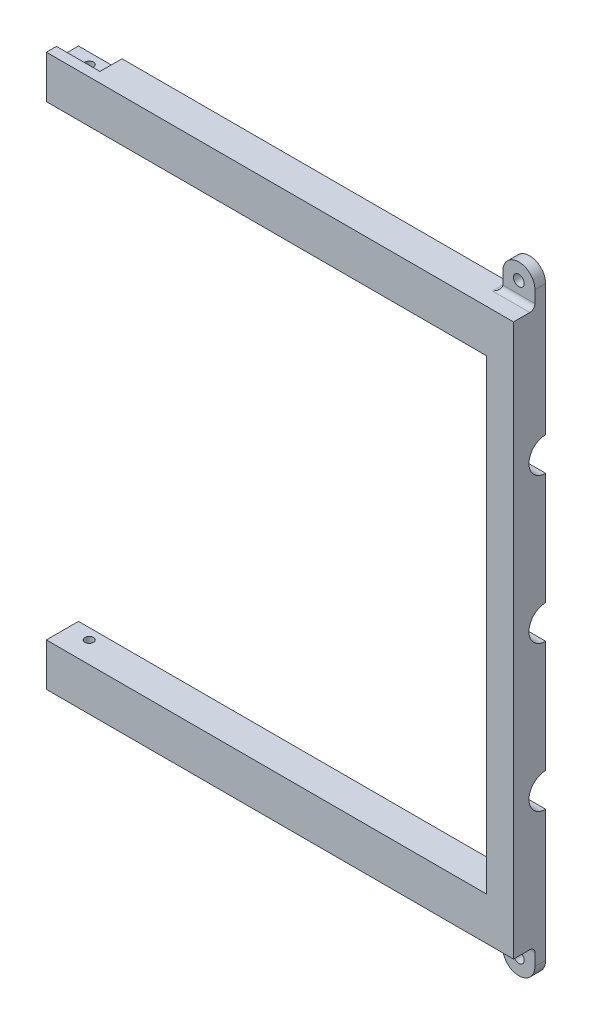
ISO-10303-21;
HEADER;
FILE_DESCRIPTION(('STEP AP214'),'2;1');
FILE_NAME('part.step','',(''),(''),'','','');
FILE_SCHEMA(('AUTOMOTIVE_DESIGN { 1 0 10303 214 1 1 1 1 }'));
ENDSEC;
DATA;
#1=APPLICATION_CONTEXT('core data for automotive mechanical design processes');
#2=APPLICATION_PROTOCOL_DEFINITION('international standard','automotive_design',2000,#1);
#3=PRODUCT_CONTEXT('',#1,'mechanical');
#4=PRODUCT('Part','Part','',(#3));
#5=PRODUCT_RELATED_PRODUCT_CATEGORY('part','',(#4));
#6=PRODUCT_DEFINITION_FORMATION('','',#4);
#7=PRODUCT_DEFINITION_CONTEXT('part definition',#1,'design');
#8=PRODUCT_DEFINITION('design','',#6,#7);
#9=PRODUCT_DEFINITION_SHAPE('','',#8);
#10=(LENGTH_UNIT() NAMED_UNIT(*) SI_UNIT(.MILLI.,.METRE.));
#11=(NAMED_UNIT(*) PLANE_ANGLE_UNIT() SI_UNIT($,.RADIAN.));
#12=(NAMED_UNIT(*) SI_UNIT($,.STERADIAN.) SOLID_ANGLE_UNIT());
#13=UNCERTAINTY_MEASURE_WITH_UNIT(LENGTH_MEASURE(1.E-05),#10,'distance_accuracy_value','');
#14=(GEOMETRIC_REPRESENTATION_CONTEXT(3) GLOBAL_UNCERTAINTY_ASSIGNED_CONTEXT((#13)) GLOBAL_UNIT_ASSIGNED_CONTEXT((#10,
#11,#12)) REPRESENTATION_CONTEXT('',''));
#15=CARTESIAN_POINT('',(0.,0.,0.));
#16=DIRECTION('',(0.,0.,1.));
#17=DIRECTION('',(1.,0.,0.));
#18=AXIS2_PLACEMENT_3D('',#15,#16,#17);
#19=CARTESIAN_POINT('',(138.43,-81.7626,9.525));
#20=DIRECTION('',(0.,1.,0.));
#21=DIRECTION('',(0.,0.,1.));
#22=AXIS2_PLACEMENT_3D('',#19,#20,#21);
#23=PLANE('',#22);
#24=DIRECTION('',(-1.,0.,0.));
#25=VECTOR('',#24,1.);
#26=CARTESIAN_POINT('',(12.8905,-81.7626,6.5405));
#27=LINE('',#26,#25);
#28=CARTESIAN_POINT('',(12.8905,-81.7626,6.5405));
#29=VERTEX_POINT('',#28);
#30=CARTESIAN_POINT('',(0.,-81.7626,6.5405));
#31=VERTEX_POINT('',#30);
#32=EDGE_CURVE('E275',#29,#31,#27,.T.);
#33=ORIENTED_EDGE('',*,*,#32,.F.);
#34=DIRECTION('',(0.,0.,1.));
#35=VECTOR('',#34,1.);
#36=CARTESIAN_POINT('',(12.8905,-81.7626,6.5405));
#37=LINE('',#36,#35);
#38=CARTESIAN_POINT('',(12.8905,-81.7626,0.));
#39=VERTEX_POINT('',#38);
#40=EDGE_CURVE('E279',#39,#29,#37,.T.);
#41=ORIENTED_EDGE('',*,*,#40,.F.);
#42=DIRECTION('',(-1.,0.,0.));
#43=VECTOR('',#42,1.);
#44=CARTESIAN_POINT('',(138.43,-81.7626,0.));
#45=LINE('',#44,#43);
#46=CARTESIAN_POINT('',(127.381,-81.7626,0.));
#47=VERTEX_POINT('',#46);
#48=EDGE_CURVE('E408',#47,#39,#45,.T.);
#49=ORIENTED_EDGE('',*,*,#48,.F.);
#50=DIRECTION('',(0.,0.,-1.));
#51=VECTOR('',#50,1.);
#52=CARTESIAN_POINT('',(127.381,-81.7626,9.525));
#53=LINE('',#52,#51);
#54=CARTESIAN_POINT('',(127.381,-81.7626,4.699));
#55=VERTEX_POINT('',#54);
#56=EDGE_CURVE('E435',#55,#47,#53,.T.);
#57=ORIENTED_EDGE('',*,*,#56,.F.);
#58=DIRECTION('',(-1.,0.,0.));
#59=VECTOR('',#58,1.);
#60=CARTESIAN_POINT('',(138.43,-81.7626,4.699));
#61=LINE('',#60,#59);
#62=CARTESIAN_POINT('',(138.43,-81.7626,4.699));
#63=VERTEX_POINT('',#62);
#64=EDGE_CURVE('E432',#63,#55,#61,.T.);
#65=ORIENTED_EDGE('',*,*,#64,.F.);
#66=DIRECTION('',(0.,0.,-1.));
#67=VECTOR('',#66,1.);
#68=CARTESIAN_POINT('',(138.43,-81.7626,9.525));
#69=LINE('',#68,#67);
#70=CARTESIAN_POINT('',(138.43,-81.7626,9.525));
#71=VERTEX_POINT('',#70);
#72=EDGE_CURVE('E416',#71,#63,#69,.T.);
#73=ORIENTED_EDGE('',*,*,#72,.F.);
#74=DIRECTION('',(-1.,0.,0.));
#75=VECTOR('',#74,1.);
#76=CARTESIAN_POINT('',(138.43,-81.7626,9.525));
#77=LINE('',#76,#75);
#78=CARTESIAN_POINT('',(0.,-81.7626,9.525));
#79=VERTEX_POINT('',#78);
#80=EDGE_CURVE('E397',#71,#79,#77,.T.);
#81=ORIENTED_EDGE('',*,*,#80,.T.);
#82=DIRECTION('',(0.,0.,1.));
#83=VECTOR('',#82,1.);
#84=CARTESIAN_POINT('',(0.,-81.7626,9.525));
#85=LINE('',#84,#83);
#86=EDGE_CURVE('E255',#31,#79,#85,.T.);
#87=ORIENTED_EDGE('',*,*,#86,.F.);
#88=EDGE_LOOP('',(#33,#41,#49,#57,#65,#73,#81,#87));
#89=FACE_BOUND('',#88,.T.);
#90=ADVANCED_FACE('F35',(#89),#23,.F.);
#91=CARTESIAN_POINT('',(0.,0.,0.));
#92=DIRECTION('',(0.,0.,-1.));
#93=DIRECTION('',(1.,0.,0.));
#94=AXIS2_PLACEMENT_3D('',#91,#92,#93);
#95=PLANE('',#94);
#96=DIRECTION('',(0.,-1.,0.));
#97=VECTOR('',#96,1.);
#98=CARTESIAN_POINT('',(0.,103.000167651619,0.));
#99=LINE('',#98,#97);
#100=CARTESIAN_POINT('',(0.,-69.0626,0.));
#101=VERTEX_POINT('',#100);
#102=CARTESIAN_POINT('',(0.,-78.5876,0.));
#103=VERTEX_POINT('',#102);
#104=EDGE_CURVE('E252',#101,#103,#99,.T.);
#105=ORIENTED_EDGE('',*,*,#104,.F.);
#106=DIRECTION('',(-1.,0.,0.));
#107=VECTOR('',#106,1.);
#108=CARTESIAN_POINT('',(130.4798,-69.0626,0.));
#109=LINE('',#108,#107);
#110=CARTESIAN_POINT('',(130.4798,-69.0626,0.));
#111=VERTEX_POINT('',#110);
#112=EDGE_CURVE('E380',#111,#101,#109,.T.);
#113=ORIENTED_EDGE('',*,*,#112,.F.);
#114=DIRECTION('',(0.,-1.,0.));
#115=VECTOR('',#114,1.);
#116=CARTESIAN_POINT('',(130.4798,-69.0626,0.));
#117=LINE('',#116,#115);
#118=CARTESIAN_POINT('',(130.4798,-48.0568,0.));
#119=VERTEX_POINT('',#118);
#120=EDGE_CURVE('E247',#119,#111,#117,.T.);
#121=ORIENTED_EDGE('',*,*,#120,.F.);
#122=DIRECTION('',(-1.,0.,0.));
#123=VECTOR('',#122,1.);
#124=CARTESIAN_POINT('',(138.43,-48.0568,0.));
#125=LINE('',#124,#123);
#126=CARTESIAN_POINT('',(138.43,-48.0568,0.));
#127=VERTEX_POINT('',#126);
#128=EDGE_CURVE('E373',#119,#127,#125,.F.);
#129=ORIENTED_EDGE('',*,*,#128,.T.);
#130=DIRECTION('',(0.,-1.,0.));
#131=VECTOR('',#130,1.);
#132=CARTESIAN_POINT('',(138.43,-81.7626,0.));
#133=LINE('',#132,#131);
#134=CARTESIAN_POINT('',(138.43,-86.8426,0.));
#135=VERTEX_POINT('',#134);
#136=EDGE_CURVE('E394',#127,#135,#133,.T.);
#137=ORIENTED_EDGE('',*,*,#136,.T.);
#138=CARTESIAN_POINT('',(133.6675,-86.8426,0.));
#139=DIRECTION('',(0.,0.,1.));
#140=DIRECTION('',(1.,0.,0.));
#141=AXIS2_PLACEMENT_3D('',#138,#139,#140);
#142=CIRCLE('',#141,4.7625);
#143=CARTESIAN_POINT('',(128.905,-86.8426,0.));
#144=VERTEX_POINT('',#143);
#145=EDGE_CURVE('E319',#144,#135,#142,.T.);
#146=ORIENTED_EDGE('',*,*,#145,.F.);
#147=DIRECTION('',(0.,-1.,0.));
#148=VECTOR('',#147,1.);
#149=CARTESIAN_POINT('',(128.905,-81.7626,0.));
#150=LINE('',#149,#148);
#151=CARTESIAN_POINT('',(128.905,-83.2866,0.));
#152=VERTEX_POINT('',#151);
#153=EDGE_CURVE('E311',#152,#144,#150,.T.);
#154=ORIENTED_EDGE('',*,*,#153,.F.);
#155=CARTESIAN_POINT('',(127.381,-83.2866,0.));
#156=DIRECTION('',(0.,0.,1.));
#157=DIRECTION('',(1.,0.,0.));
#158=AXIS2_PLACEMENT_3D('',#155,#156,#157);
#159=CIRCLE('',#158,1.524);
#160=EDGE_CURVE('E449',#47,#152,#159,.F.);
#161=ORIENTED_EDGE('',*,*,#160,.F.);
#162=ORIENTED_EDGE('',*,*,#48,.T.);
#163=DIRECTION('',(0.,-1.,0.));
#164=VECTOR('',#163,1.);
#165=CARTESIAN_POINT('',(12.8905,0.,0.));
#166=LINE('',#165,#164);
#167=CARTESIAN_POINT('',(12.8905,-78.5876,0.));
#168=VERTEX_POINT('',#167);
#169=EDGE_CURVE('E43',#168,#39,#166,.T.);
#170=ORIENTED_EDGE('',*,*,#169,.F.);
#171=DIRECTION('',(-1.,0.,0.));
#172=VECTOR('',#171,1.);
#173=CARTESIAN_POINT('',(0.,-78.5876,0.));
#174=LINE('',#173,#172);
#175=EDGE_CURVE('E463',#168,#103,#174,.T.);
#176=ORIENTED_EDGE('',*,*,#175,.T.);
#177=EDGE_LOOP('',(#105,#113,#121,#129,#137,#146,#154,#161,#162,#170,#176));
#178=FACE_BOUND('',#177,.T.);
#179=CARTESIAN_POINT('',(133.6675,-86.8426,0.));
#180=DIRECTION('',(0.,0.,1.));
#181=DIRECTION('',(-1.,0.,0.));
#182=AXIS2_PLACEMENT_3D('',#179,#180,#181);
#183=CIRCLE('',#182,1.58749999999999);
#184=CARTESIAN_POINT('',(132.08,-86.8426,0.));
#185=VERTEX_POINT('',#184);
#186=EDGE_CURVE('E312',#185,#185,#183,.T.);
#187=ORIENTED_EDGE('',*,*,#186,.T.);
#188=EDGE_LOOP('',(#187));
#189=FACE_BOUND('',#188,.T.);
#190=ADVANCED_FACE('F475',(#178,#189),#95,.T.);
#191=DIRECTION('',(-1.,0.,0.));
#192=VECTOR('',#191,1.);
#193=CARTESIAN_POINT('',(138.43,-38.1508,0.));
#194=LINE('',#193,#192);
#195=CARTESIAN_POINT('',(138.43,-38.1508,0.));
#196=VERTEX_POINT('',#195);
#197=CARTESIAN_POINT('',(130.4798,-38.1508,0.));
#198=VERTEX_POINT('',#197);
#199=EDGE_CURVE('E248',#196,#198,#194,.T.);
#200=ORIENTED_EDGE('',*,*,#199,.T.);
#201=CARTESIAN_POINT('',(130.4798,-4.953,0.));
#202=VERTEX_POINT('',#201);
#203=EDGE_CURVE('E497',#202,#198,#117,.T.);
#204=ORIENTED_EDGE('',*,*,#203,.F.);
#205=DIRECTION('',(-1.,0.,0.));
#206=VECTOR('',#205,1.);
#207=CARTESIAN_POINT('',(138.43,-4.953,0.));
#208=LINE('',#207,#206);
#209=CARTESIAN_POINT('',(138.43,-4.953,0.));
#210=VERTEX_POINT('',#209);
#211=EDGE_CURVE('E362',#202,#210,#208,.F.);
#212=ORIENTED_EDGE('',*,*,#211,.T.);
#213=EDGE_CURVE('E517',#210,#196,#133,.T.);
#214=ORIENTED_EDGE('',*,*,#213,.T.);
#215=EDGE_LOOP('',(#200,#204,#212,#214));
#216=FACE_BOUND('',#215,.T.);
#217=ADVANCED_FACE('F515',(#216),#95,.T.);
#218=CARTESIAN_POINT('',(0.,78.5876,0.));
#219=VERTEX_POINT('',#218);
#220=CARTESIAN_POINT('',(0.,69.0626,0.));
#221=VERTEX_POINT('',#220);
#222=EDGE_CURVE('E243',#219,#221,#99,.T.);
#223=ORIENTED_EDGE('',*,*,#222,.F.);
#224=DIRECTION('',(1.,0.,0.));
#225=VECTOR('',#224,1.);
#226=CARTESIAN_POINT('',(0.,78.5876,0.));
#227=LINE('',#226,#225);
#228=CARTESIAN_POINT('',(12.8905,78.5876,0.));
#229=VERTEX_POINT('',#228);
#230=EDGE_CURVE('E461',#219,#229,#227,.T.);
#231=ORIENTED_EDGE('',*,*,#230,.T.);
#232=DIRECTION('',(0.,1.,0.));
#233=VECTOR('',#232,1.);
#234=CARTESIAN_POINT('',(12.8905,0.,0.));
#235=LINE('',#234,#233);
#236=CARTESIAN_POINT('',(12.8905,81.7626,0.));
#237=VERTEX_POINT('',#236);
#238=EDGE_CURVE('E304',#229,#237,#235,.T.);
#239=ORIENTED_EDGE('',*,*,#238,.T.);
#240=DIRECTION('',(1.,0.,0.));
#241=VECTOR('',#240,1.);
#242=CARTESIAN_POINT('',(138.43,81.7626,0.));
#243=LINE('',#242,#241);
#244=CARTESIAN_POINT('',(127.381,81.7626,0.));
#245=VERTEX_POINT('',#244);
#246=EDGE_CURVE('E398',#237,#245,#243,.T.);
#247=ORIENTED_EDGE('',*,*,#246,.T.);
#248=CARTESIAN_POINT('',(127.381,83.2866,0.));
#249=DIRECTION('',(0.,0.,1.));
#250=DIRECTION('',(1.,0.,0.));
#251=AXIS2_PLACEMENT_3D('',#248,#249,#250);
#252=CIRCLE('',#251,1.524);
#253=CARTESIAN_POINT('',(128.905,83.2866,0.));
#254=VERTEX_POINT('',#253);
#255=EDGE_CURVE('E446',#254,#245,#252,.F.);
#256=ORIENTED_EDGE('',*,*,#255,.F.);
#257=DIRECTION('',(0.,1.,0.));
#258=VECTOR('',#257,1.);
#259=CARTESIAN_POINT('',(128.905,81.7626,0.));
#260=LINE('',#259,#258);
#261=CARTESIAN_POINT('',(128.905,86.8426,0.));
#262=VERTEX_POINT('',#261);
#263=EDGE_CURVE('E343',#254,#262,#260,.T.);
#264=ORIENTED_EDGE('',*,*,#263,.T.);
#265=CARTESIAN_POINT('',(133.6675,86.8426,0.));
#266=DIRECTION('',(0.,0.,-1.));
#267=DIRECTION('',(1.,0.,0.));
#268=AXIS2_PLACEMENT_3D('',#265,#266,#267);
#269=CIRCLE('',#268,4.7625);
#270=CARTESIAN_POINT('',(138.43,86.8426,0.));
#271=VERTEX_POINT('',#270);
#272=EDGE_CURVE('E336',#262,#271,#269,.T.);
#273=ORIENTED_EDGE('',*,*,#272,.T.);
#274=CARTESIAN_POINT('',(138.43,48.0568,0.));
#275=VERTEX_POINT('',#274);
#276=EDGE_CURVE('E405',#271,#275,#133,.T.);
#277=ORIENTED_EDGE('',*,*,#276,.T.);
#278=DIRECTION('',(-1.,0.,0.));
#279=VECTOR('',#278,1.);
#280=CARTESIAN_POINT('',(138.43,48.0568,0.));
#281=LINE('',#280,#279);
#282=CARTESIAN_POINT('',(130.4798,48.0568,0.));
#283=VERTEX_POINT('',#282);
#284=EDGE_CURVE('E371',#275,#283,#281,.T.);
#285=ORIENTED_EDGE('',*,*,#284,.T.);
#286=CARTESIAN_POINT('',(130.4798,69.0626,0.));
#287=VERTEX_POINT('',#286);
#288=EDGE_CURVE('E246',#287,#283,#117,.T.);
#289=ORIENTED_EDGE('',*,*,#288,.F.);
#290=DIRECTION('',(1.,0.,0.));
#291=VECTOR('',#290,1.);
#292=CARTESIAN_POINT('',(130.4798,69.0626,0.));
#293=LINE('',#292,#291);
#294=EDGE_CURVE('E229',#221,#287,#293,.T.);
#295=ORIENTED_EDGE('',*,*,#294,.F.);
#296=EDGE_LOOP('',(#223,#231,#239,#247,#256,#264,#273,#277,#285,#289,#295));
#297=FACE_BOUND('',#296,.T.);
#298=CARTESIAN_POINT('',(133.6675,86.8426,0.));
#299=DIRECTION('',(0.,0.,-1.));
#300=DIRECTION('',(-1.,0.,0.));
#301=AXIS2_PLACEMENT_3D('',#298,#299,#300);
#302=CIRCLE('',#301,1.58749999999999);
#303=CARTESIAN_POINT('',(132.08,86.8426,0.));
#304=VERTEX_POINT('',#303);
#305=EDGE_CURVE('E331',#304,#304,#302,.T.);
#306=ORIENTED_EDGE('',*,*,#305,.F.);
#307=EDGE_LOOP('',(#306));
#308=FACE_BOUND('',#307,.T.);
#309=ADVANCED_FACE('F240',(#297,#308),#95,.T.);
#310=DIRECTION('',(-1.,0.,0.));
#311=VECTOR('',#310,1.);
#312=CARTESIAN_POINT('',(138.43,38.1508,0.));
#313=LINE('',#312,#311);
#314=CARTESIAN_POINT('',(130.4798,38.1508,0.));
#315=VERTEX_POINT('',#314);
#316=CARTESIAN_POINT('',(138.43,38.1508,0.));
#317=VERTEX_POINT('',#316);
#318=EDGE_CURVE('E368',#315,#317,#313,.F.);
#319=ORIENTED_EDGE('',*,*,#318,.T.);
#320=CARTESIAN_POINT('',(138.43,4.953,0.));
#321=VERTEX_POINT('',#320);
#322=EDGE_CURVE('E409',#317,#321,#133,.T.);
#323=ORIENTED_EDGE('',*,*,#322,.T.);
#324=DIRECTION('',(-1.,0.,0.));
#325=VECTOR('',#324,1.);
#326=CARTESIAN_POINT('',(138.43,4.953,0.));
#327=LINE('',#326,#325);
#328=CARTESIAN_POINT('',(130.4798,4.953,0.));
#329=VERTEX_POINT('',#328);
#330=EDGE_CURVE('E365',#321,#329,#327,.T.);
#331=ORIENTED_EDGE('',*,*,#330,.T.);
#332=EDGE_CURVE('E388',#315,#329,#117,.T.);
#333=ORIENTED_EDGE('',*,*,#332,.F.);
#334=EDGE_LOOP('',(#319,#323,#331,#333));
#335=FACE_BOUND('',#334,.T.);
#336=ADVANCED_FACE('F508',(#335),#95,.T.);
#337=CARTESIAN_POINT('',(0.,0.,9.525));
#338=DIRECTION('',(0.,0.,-1.));
#339=DIRECTION('',(1.,0.,0.));
#340=AXIS2_PLACEMENT_3D('',#337,#338,#339);
#341=PLANE('',#340);
#342=ORIENTED_EDGE('',*,*,#80,.F.);
#343=DIRECTION('',(0.,-1.,0.));
#344=VECTOR('',#343,1.);
#345=CARTESIAN_POINT('',(138.43,-81.7626,9.525));
#346=LINE('',#345,#344);
#347=CARTESIAN_POINT('',(138.43,81.7626,9.525));
#348=VERTEX_POINT('',#347);
#349=EDGE_CURVE('E395',#348,#71,#346,.T.);
#350=ORIENTED_EDGE('',*,*,#349,.F.);
#351=DIRECTION('',(1.,0.,0.));
#352=VECTOR('',#351,1.);
#353=CARTESIAN_POINT('',(138.43,81.7626,9.525));
#354=LINE('',#353,#352);
#355=CARTESIAN_POINT('',(0.,81.7626,9.525));
#356=VERTEX_POINT('',#355);
#357=EDGE_CURVE('E401',#356,#348,#354,.T.);
#358=ORIENTED_EDGE('',*,*,#357,.F.);
#359=DIRECTION('',(0.,-1.,0.));
#360=VECTOR('',#359,1.);
#361=CARTESIAN_POINT('',(0.,0.,9.525));
#362=LINE('',#361,#360);
#363=CARTESIAN_POINT('',(0.,69.0626,9.525));
#364=VERTEX_POINT('',#363);
#365=EDGE_CURVE('E257',#356,#364,#362,.T.);
#366=ORIENTED_EDGE('',*,*,#365,.T.);
#367=DIRECTION('',(1.,0.,0.));
#368=VECTOR('',#367,1.);
#369=CARTESIAN_POINT('',(130.4798,69.0626,9.525));
#370=LINE('',#369,#368);
#371=CARTESIAN_POINT('',(130.4798,69.0626,9.525));
#372=VERTEX_POINT('',#371);
#373=EDGE_CURVE('E232',#364,#372,#370,.T.);
#374=ORIENTED_EDGE('',*,*,#373,.T.);
#375=DIRECTION('',(0.,-1.,0.));
#376=VECTOR('',#375,1.);
#377=CARTESIAN_POINT('',(130.4798,-69.0626,9.525));
#378=LINE('',#377,#376);
#379=CARTESIAN_POINT('',(130.4798,-69.0626,9.525));
#380=VERTEX_POINT('',#379);
#381=EDGE_CURVE('E379',#372,#380,#378,.T.);
#382=ORIENTED_EDGE('',*,*,#381,.T.);
#383=DIRECTION('',(-1.,0.,0.));
#384=VECTOR('',#383,1.);
#385=CARTESIAN_POINT('',(130.4798,-69.0626,9.525));
#386=LINE('',#385,#384);
#387=CARTESIAN_POINT('',(0.,-69.0626,9.525));
#388=VERTEX_POINT('',#387);
#389=EDGE_CURVE('E383',#380,#388,#386,.T.);
#390=ORIENTED_EDGE('',*,*,#389,.T.);
#391=EDGE_CURVE('E259',#388,#79,#362,.T.);
#392=ORIENTED_EDGE('',*,*,#391,.T.);
#393=EDGE_LOOP('',(#342,#350,#358,#366,#374,#382,#390,#392));
#394=FACE_BOUND('',#393,.T.);
#395=ADVANCED_FACE('F545',(#394),#341,.F.);
#396=CARTESIAN_POINT('',(138.43,-81.7626,9.525));
#397=DIRECTION('',(-1.,0.,0.));
#398=DIRECTION('',(0.,0.,-1.));
#399=AXIS2_PLACEMENT_3D('',#396,#397,#398);
#400=PLANE('',#399);
#401=ORIENTED_EDGE('',*,*,#213,.F.);
#402=CARTESIAN_POINT('',(138.43,0.,0.));
#403=DIRECTION('',(1.,0.,0.));
#404=DIRECTION('',(0.,0.,-1.));
#405=AXIS2_PLACEMENT_3D('',#402,#403,#404);
#406=CIRCLE('',#405,4.953);
#407=EDGE_CURVE('E359',#321,#210,#406,.T.);
#408=ORIENTED_EDGE('',*,*,#407,.F.);
#409=ORIENTED_EDGE('',*,*,#322,.F.);
#410=CARTESIAN_POINT('',(138.43,43.1038,0.));
#411=DIRECTION('',(1.,0.,0.));
#412=DIRECTION('',(0.,0.,-1.));
#413=AXIS2_PLACEMENT_3D('',#410,#411,#412);
#414=CIRCLE('',#413,4.953);
#415=EDGE_CURVE('E357',#275,#317,#414,.T.);
#416=ORIENTED_EDGE('',*,*,#415,.F.);
#417=ORIENTED_EDGE('',*,*,#276,.F.);
#418=DIRECTION('',(0.,0.,-1.));
#419=VECTOR('',#418,1.);
#420=CARTESIAN_POINT('',(138.43,86.8426,3.175));
#421=LINE('',#420,#419);
#422=CARTESIAN_POINT('',(138.43,86.8426,3.175));
#423=VERTEX_POINT('',#422);
#424=EDGE_CURVE('E348',#423,#271,#421,.T.);
#425=ORIENTED_EDGE('',*,*,#424,.F.);
#426=DIRECTION('',(0.,-1.,0.));
#427=VECTOR('',#426,1.);
#428=CARTESIAN_POINT('',(138.43,81.7626,3.175));
#429=LINE('',#428,#427);
#430=CARTESIAN_POINT('',(138.43,83.2866,3.175));
#431=VERTEX_POINT('',#430);
#432=EDGE_CURVE('E339',#423,#431,#429,.T.);
#433=ORIENTED_EDGE('',*,*,#432,.T.);
#434=CARTESIAN_POINT('',(138.43,83.2866,4.699));
#435=DIRECTION('',(1.,0.,0.));
#436=DIRECTION('',(0.,0.,-1.));
#437=AXIS2_PLACEMENT_3D('',#434,#435,#436);
#438=CIRCLE('',#437,1.524);
#439=CARTESIAN_POINT('',(138.43,81.7626,4.699));
#440=VERTEX_POINT('',#439);
#441=EDGE_CURVE('E454',#440,#431,#438,.T.);
#442=ORIENTED_EDGE('',*,*,#441,.F.);
#443=DIRECTION('',(0.,0.,-1.));
#444=VECTOR('',#443,1.);
#445=CARTESIAN_POINT('',(138.43,81.7626,9.525));
#446=LINE('',#445,#444);
#447=EDGE_CURVE('E404',#348,#440,#446,.T.);
#448=ORIENTED_EDGE('',*,*,#447,.F.);
#449=ORIENTED_EDGE('',*,*,#349,.T.);
#450=ORIENTED_EDGE('',*,*,#72,.T.);
#451=CARTESIAN_POINT('',(138.43,-83.2866,4.699));
#452=DIRECTION('',(1.,0.,0.));
#453=DIRECTION('',(0.,0.,-1.));
#454=AXIS2_PLACEMENT_3D('',#451,#452,#453);
#455=CIRCLE('',#454,1.524);
#456=CARTESIAN_POINT('',(138.43,-83.2866,3.175));
#457=VERTEX_POINT('',#456);
#458=EDGE_CURVE('E452',#457,#63,#455,.T.);
#459=ORIENTED_EDGE('',*,*,#458,.F.);
#460=DIRECTION('',(0.,1.,0.));
#461=VECTOR('',#460,1.);
#462=CARTESIAN_POINT('',(138.43,-81.7626,3.175));
#463=LINE('',#462,#461);
#464=CARTESIAN_POINT('',(138.43,-86.8426,3.175));
#465=VERTEX_POINT('',#464);
#466=EDGE_CURVE('E321',#465,#457,#463,.T.);
#467=ORIENTED_EDGE('',*,*,#466,.F.);
#468=DIRECTION('',(0.,0.,-1.));
#469=VECTOR('',#468,1.);
#470=CARTESIAN_POINT('',(138.43,-86.8426,3.175));
#471=LINE('',#470,#469);
#472=EDGE_CURVE('E329',#465,#135,#471,.T.);
#473=ORIENTED_EDGE('',*,*,#472,.T.);
#474=ORIENTED_EDGE('',*,*,#136,.F.);
#475=CARTESIAN_POINT('',(138.43,-43.1038,0.));
#476=DIRECTION('',(1.,0.,0.));
#477=DIRECTION('',(0.,0.,-1.));
#478=AXIS2_PLACEMENT_3D('',#475,#476,#477);
#479=CIRCLE('',#478,4.953);
#480=EDGE_CURVE('E355',#196,#127,#479,.T.);
#481=ORIENTED_EDGE('',*,*,#480,.F.);
#482=EDGE_LOOP('',(#401,#408,#409,#416,#417,#425,#433,#442,#448,#449,#450,#459,#467,#473,#474,#481));
#483=FACE_BOUND('',#482,.T.);
#484=ADVANCED_FACE('F522',(#483),#400,.F.);
#485=CARTESIAN_POINT('',(138.43,81.7626,9.525));
#486=DIRECTION('',(0.,-1.,0.));
#487=DIRECTION('',(0.,0.,-1.));
#488=AXIS2_PLACEMENT_3D('',#485,#486,#487);
#489=PLANE('',#488);
#490=ORIENTED_EDGE('',*,*,#357,.T.);
#491=ORIENTED_EDGE('',*,*,#447,.T.);
#492=DIRECTION('',(-1.,0.,0.));
#493=VECTOR('',#492,1.);
#494=CARTESIAN_POINT('',(138.43,81.7626,4.699));
#495=LINE('',#494,#493);
#496=CARTESIAN_POINT('',(127.381,81.7626,4.699));
#497=VERTEX_POINT('',#496);
#498=EDGE_CURVE('E425',#497,#440,#495,.F.);
#499=ORIENTED_EDGE('',*,*,#498,.F.);
#500=DIRECTION('',(0.,0.,-1.));
#501=VECTOR('',#500,1.);
#502=CARTESIAN_POINT('',(127.381,81.7626,3.175));
#503=LINE('',#502,#501);
#504=EDGE_CURVE('E427',#245,#497,#503,.F.);
#505=ORIENTED_EDGE('',*,*,#504,.F.);
#506=ORIENTED_EDGE('',*,*,#246,.F.);
#507=DIRECTION('',(0.,0.,-1.));
#508=VECTOR('',#507,1.);
#509=CARTESIAN_POINT('',(12.8905,81.7626,9.525));
#510=LINE('',#509,#508);
#511=CARTESIAN_POINT('',(12.8905,81.7626,6.5405));
#512=VERTEX_POINT('',#511);
#513=EDGE_CURVE('E457',#512,#237,#510,.T.);
#514=ORIENTED_EDGE('',*,*,#513,.F.);
#515=DIRECTION('',(-1.,0.,0.));
#516=VECTOR('',#515,1.);
#517=CARTESIAN_POINT('',(12.8905,81.7626,6.5405));
#518=LINE('',#517,#516);
#519=CARTESIAN_POINT('',(0.,81.7626,6.5405));
#520=VERTEX_POINT('',#519);
#521=EDGE_CURVE('E294',#512,#520,#518,.T.);
#522=ORIENTED_EDGE('',*,*,#521,.T.);
#523=DIRECTION('',(0.,0.,-1.));
#524=VECTOR('',#523,1.);
#525=CARTESIAN_POINT('',(0.,81.7626,9.525));
#526=LINE('',#525,#524);
#527=EDGE_CURVE('E266',#356,#520,#526,.T.);
#528=ORIENTED_EDGE('',*,*,#527,.F.);
#529=EDGE_LOOP('',(#490,#491,#499,#505,#506,#514,#522,#528));
#530=FACE_BOUND('',#529,.T.);
#531=ADVANCED_FACE('F567',(#530),#489,.F.);
#532=CARTESIAN_POINT('',(130.4798,69.0626,9.525));
#533=DIRECTION('',(0.,-1.,0.));
#534=DIRECTION('',(0.,0.,-1.));
#535=AXIS2_PLACEMENT_3D('',#532,#533,#534);
#536=PLANE('',#535);
#537=DIRECTION('',(0.,0.,-1.));
#538=VECTOR('',#537,1.);
#539=CARTESIAN_POINT('',(0.,69.0626,9.525));
#540=LINE('',#539,#538);
#541=EDGE_CURVE('E225',#364,#221,#540,.T.);
#542=ORIENTED_EDGE('',*,*,#541,.T.);
#543=ORIENTED_EDGE('',*,*,#294,.T.);
#544=DIRECTION('',(0.,0.,-1.));
#545=VECTOR('',#544,1.);
#546=CARTESIAN_POINT('',(130.4798,69.0626,9.525));
#547=LINE('',#546,#545);
#548=EDGE_CURVE('E392',#372,#287,#547,.T.);
#549=ORIENTED_EDGE('',*,*,#548,.F.);
#550=ORIENTED_EDGE('',*,*,#373,.F.);
#551=EDGE_LOOP('',(#542,#543,#549,#550));
#552=FACE_BOUND('',#551,.T.);
#553=CARTESIAN_POINT('',(6.35,69.0626,3.175));
#554=DIRECTION('',(0.,1.,0.));
#555=DIRECTION('',(0.,0.,-1.));
#556=AXIS2_PLACEMENT_3D('',#553,#554,#555);
#557=CIRCLE('',#556,1.27);
#558=CARTESIAN_POINT('',(6.35,69.0626,1.905));
#559=VERTEX_POINT('',#558);
#560=EDGE_CURVE('E288',#559,#559,#557,.F.);
#561=ORIENTED_EDGE('',*,*,#560,.F.);
#562=EDGE_LOOP('',(#561));
#563=FACE_BOUND('',#562,.T.);
#564=ADVANCED_FACE('F227',(#552,#563),#536,.T.);
#565=CARTESIAN_POINT('',(130.4798,-69.0626,9.525));
#566=DIRECTION('',(-1.,0.,0.));
#567=DIRECTION('',(0.,0.,-1.));
#568=AXIS2_PLACEMENT_3D('',#565,#566,#567);
#569=PLANE('',#568);
#570=CARTESIAN_POINT('',(130.4798,-43.1038,0.));
#571=DIRECTION('',(1.,0.,0.));
#572=DIRECTION('',(0.,0.,-1.));
#573=AXIS2_PLACEMENT_3D('',#570,#571,#572);
#574=CIRCLE('',#573,4.953);
#575=EDGE_CURVE('E423',#198,#119,#574,.T.);
#576=ORIENTED_EDGE('',*,*,#575,.T.);
#577=ORIENTED_EDGE('',*,*,#120,.T.);
#578=DIRECTION('',(0.,0.,-1.));
#579=VECTOR('',#578,1.);
#580=CARTESIAN_POINT('',(130.4798,-69.0626,9.525));
#581=LINE('',#580,#579);
#582=EDGE_CURVE('E385',#380,#111,#581,.T.);
#583=ORIENTED_EDGE('',*,*,#582,.F.);
#584=ORIENTED_EDGE('',*,*,#381,.F.);
#585=ORIENTED_EDGE('',*,*,#548,.T.);
#586=ORIENTED_EDGE('',*,*,#288,.T.);
#587=CARTESIAN_POINT('',(130.4798,43.1038,0.));
#588=DIRECTION('',(1.,0.,0.));
#589=DIRECTION('',(0.,0.,-1.));
#590=AXIS2_PLACEMENT_3D('',#587,#588,#589);
#591=CIRCLE('',#590,4.953);
#592=EDGE_CURVE('E421',#283,#315,#591,.T.);
#593=ORIENTED_EDGE('',*,*,#592,.T.);
#594=ORIENTED_EDGE('',*,*,#332,.T.);
#595=CARTESIAN_POINT('',(130.4798,0.,0.));
#596=DIRECTION('',(1.,0.,0.));
#597=DIRECTION('',(0.,0.,-1.));
#598=AXIS2_PLACEMENT_3D('',#595,#596,#597);
#599=CIRCLE('',#598,4.953);
#600=EDGE_CURVE('E419',#329,#202,#599,.T.);
#601=ORIENTED_EDGE('',*,*,#600,.T.);
#602=ORIENTED_EDGE('',*,*,#203,.T.);
#603=EDGE_LOOP('',(#576,#577,#583,#584,#585,#586,#593,#594,#601,#602));
#604=FACE_BOUND('',#603,.T.);
#605=ADVANCED_FACE('F502',(#604),#569,.T.);
#606=CARTESIAN_POINT('',(130.4798,-69.0626,9.525));
#607=DIRECTION('',(0.,1.,0.));
#608=DIRECTION('',(0.,0.,1.));
#609=AXIS2_PLACEMENT_3D('',#606,#607,#608);
#610=PLANE('',#609);
#611=DIRECTION('',(0.,0.,1.));
#612=VECTOR('',#611,1.);
#613=CARTESIAN_POINT('',(0.,-69.0626,9.525));
#614=LINE('',#613,#612);
#615=EDGE_CURVE('E236',#101,#388,#614,.T.);
#616=ORIENTED_EDGE('',*,*,#615,.T.);
#617=ORIENTED_EDGE('',*,*,#389,.F.);
#618=ORIENTED_EDGE('',*,*,#582,.T.);
#619=ORIENTED_EDGE('',*,*,#112,.T.);
#620=EDGE_LOOP('',(#616,#617,#618,#619));
#621=FACE_BOUND('',#620,.T.);
#622=CARTESIAN_POINT('',(6.35,-69.0626,3.175));
#623=DIRECTION('',(0.,-1.,0.));
#624=DIRECTION('',(0.,0.,1.));
#625=AXIS2_PLACEMENT_3D('',#622,#623,#624);
#626=CIRCLE('',#625,1.27);
#627=CARTESIAN_POINT('',(6.35,-69.0626,4.445));
#628=VERTEX_POINT('',#627);
#629=EDGE_CURVE('E272',#628,#628,#626,.T.);
#630=ORIENTED_EDGE('',*,*,#629,.T.);
#631=EDGE_LOOP('',(#630));
#632=FACE_BOUND('',#631,.T.);
#633=ADVANCED_FACE('F490',(#621,#632),#610,.T.);
#634=CARTESIAN_POINT('',(138.43,0.,0.));
#635=DIRECTION('',(-1.,0.,0.));
#636=DIRECTION('',(0.,0.,-1.));
#637=AXIS2_PLACEMENT_3D('',#634,#635,#636);
#638=CYLINDRICAL_SURFACE('',#637,4.953);
#639=ORIENTED_EDGE('',*,*,#330,.F.);
#640=ORIENTED_EDGE('',*,*,#407,.T.);
#641=ORIENTED_EDGE('',*,*,#211,.F.);
#642=ORIENTED_EDGE('',*,*,#600,.F.);
#643=EDGE_LOOP('',(#639,#640,#641,#642));
#644=FACE_BOUND('',#643,.T.);
#645=ADVANCED_FACE('F511',(#644),#638,.F.);
#646=CARTESIAN_POINT('',(138.43,43.1038,0.));
#647=DIRECTION('',(-1.,0.,0.));
#648=DIRECTION('',(0.,0.,-1.));
#649=AXIS2_PLACEMENT_3D('',#646,#647,#648);
#650=CYLINDRICAL_SURFACE('',#649,4.953);
#651=ORIENTED_EDGE('',*,*,#284,.F.);
#652=ORIENTED_EDGE('',*,*,#415,.T.);
#653=ORIENTED_EDGE('',*,*,#318,.F.);
#654=ORIENTED_EDGE('',*,*,#592,.F.);
#655=EDGE_LOOP('',(#651,#652,#653,#654));
#656=FACE_BOUND('',#655,.T.);
#657=ADVANCED_FACE('F550',(#656),#650,.F.);
#658=CARTESIAN_POINT('',(138.43,-43.1038,0.));
#659=DIRECTION('',(-1.,0.,0.));
#660=DIRECTION('',(0.,0.,-1.));
#661=AXIS2_PLACEMENT_3D('',#658,#659,#660);
#662=CYLINDRICAL_SURFACE('',#661,4.953);
#663=ORIENTED_EDGE('',*,*,#199,.F.);
#664=ORIENTED_EDGE('',*,*,#480,.T.);
#665=ORIENTED_EDGE('',*,*,#128,.F.);
#666=ORIENTED_EDGE('',*,*,#575,.F.);
#667=EDGE_LOOP('',(#663,#664,#665,#666));
#668=FACE_BOUND('',#667,.T.);
#669=ADVANCED_FACE('F519',(#668),#662,.F.);
#670=CARTESIAN_POINT('',(133.6675,86.8426,3.175));
#671=DIRECTION('',(0.,0.,1.));
#672=DIRECTION('',(1.,0.,0.));
#673=AXIS2_PLACEMENT_3D('',#670,#671,#672);
#674=PLANE('',#673);
#675=ORIENTED_EDGE('',*,*,#432,.F.);
#676=CARTESIAN_POINT('',(133.6675,86.8426,3.175));
#677=DIRECTION('',(0.,0.,-1.));
#678=DIRECTION('',(1.,0.,0.));
#679=AXIS2_PLACEMENT_3D('',#676,#677,#678);
#680=CIRCLE('',#679,4.7625);
#681=CARTESIAN_POINT('',(128.905,86.8426,3.175));
#682=VERTEX_POINT('',#681);
#683=EDGE_CURVE('E342',#682,#423,#680,.T.);
#684=ORIENTED_EDGE('',*,*,#683,.F.);
#685=DIRECTION('',(0.,1.,0.));
#686=VECTOR('',#685,1.);
#687=CARTESIAN_POINT('',(128.905,81.7626,3.175));
#688=LINE('',#687,#686);
#689=CARTESIAN_POINT('',(128.905,83.2866,3.175));
#690=VERTEX_POINT('',#689);
#691=EDGE_CURVE('E345',#690,#682,#688,.T.);
#692=ORIENTED_EDGE('',*,*,#691,.F.);
#693=DIRECTION('',(-1.,0.,0.));
#694=VECTOR('',#693,1.);
#695=CARTESIAN_POINT('',(133.6675,83.2866,3.175));
#696=LINE('',#695,#694);
#697=EDGE_CURVE('E443',#431,#690,#696,.T.);
#698=ORIENTED_EDGE('',*,*,#697,.F.);
#699=EDGE_LOOP('',(#675,#684,#692,#698));
#700=FACE_BOUND('',#699,.T.);
#701=CARTESIAN_POINT('',(133.6675,86.8426,3.175));
#702=DIRECTION('',(0.,0.,-1.));
#703=DIRECTION('',(-1.,0.,0.));
#704=AXIS2_PLACEMENT_3D('',#701,#702,#703);
#705=CIRCLE('',#704,1.58749999999999);
#706=CARTESIAN_POINT('',(132.08,86.8426,3.175));
#707=VERTEX_POINT('',#706);
#708=EDGE_CURVE('E333',#707,#707,#705,.T.);
#709=ORIENTED_EDGE('',*,*,#708,.T.);
#710=EDGE_LOOP('',(#709));
#711=FACE_BOUND('',#710,.T.);
#712=ADVANCED_FACE('F561',(#700,#711),#674,.T.);
#713=CARTESIAN_POINT('',(128.905,81.7626,3.175));
#714=DIRECTION('',(1.,0.,0.));
#715=DIRECTION('',(0.,0.,1.));
#716=AXIS2_PLACEMENT_3D('',#713,#714,#715);
#717=PLANE('',#716);
#718=ORIENTED_EDGE('',*,*,#691,.T.);
#719=DIRECTION('',(0.,0.,-1.));
#720=VECTOR('',#719,1.);
#721=CARTESIAN_POINT('',(128.905,86.8426,3.175));
#722=LINE('',#721,#720);
#723=EDGE_CURVE('E353',#682,#262,#722,.T.);
#724=ORIENTED_EDGE('',*,*,#723,.T.);
#725=ORIENTED_EDGE('',*,*,#263,.F.);
#726=DIRECTION('',(0.,0.,-1.));
#727=VECTOR('',#726,1.);
#728=CARTESIAN_POINT('',(128.905,83.2866,0.));
#729=LINE('',#728,#727);
#730=EDGE_CURVE('E430',#690,#254,#729,.T.);
#731=ORIENTED_EDGE('',*,*,#730,.F.);
#732=EDGE_LOOP('',(#718,#724,#725,#731));
#733=FACE_BOUND('',#732,.T.);
#734=ADVANCED_FACE('F584',(#733),#717,.F.);
#735=CARTESIAN_POINT('',(133.6675,86.8426,3.175));
#736=DIRECTION('',(0.,0.,-1.));
#737=DIRECTION('',(1.,0.,0.));
#738=AXIS2_PLACEMENT_3D('',#735,#736,#737);
#739=CYLINDRICAL_SURFACE('',#738,4.7625);
#740=ORIENTED_EDGE('',*,*,#272,.F.);
#741=ORIENTED_EDGE('',*,*,#723,.F.);
#742=ORIENTED_EDGE('',*,*,#683,.T.);
#743=ORIENTED_EDGE('',*,*,#424,.T.);
#744=EDGE_LOOP('',(#740,#741,#742,#743));
#745=FACE_BOUND('',#744,.T.);
#746=ADVANCED_FACE('F556',(#745),#739,.T.);
#747=CARTESIAN_POINT('',(133.6675,86.8426,3.175));
#748=DIRECTION('',(0.,0.,-1.));
#749=DIRECTION('',(1.,0.,0.));
#750=AXIS2_PLACEMENT_3D('',#747,#748,#749);
#751=CYLINDRICAL_SURFACE('',#750,1.58749999999999);
#752=ORIENTED_EDGE('',*,*,#708,.F.);
#753=EDGE_LOOP('',(#752));
#754=FACE_BOUND('',#753,.T.);
#755=ORIENTED_EDGE('',*,*,#305,.T.);
#756=EDGE_LOOP('',(#755));
#757=FACE_BOUND('',#756,.T.);
#758=ADVANCED_FACE('F591',(#754,#757),#751,.F.);
#759=CARTESIAN_POINT('',(133.6675,-86.8426,3.175));
#760=DIRECTION('',(0.,0.,-1.));
#761=DIRECTION('',(1.,0.,0.));
#762=AXIS2_PLACEMENT_3D('',#759,#760,#761);
#763=CYLINDRICAL_SURFACE('',#762,4.7625);
#764=ORIENTED_EDGE('',*,*,#145,.T.);
#765=ORIENTED_EDGE('',*,*,#472,.F.);
#766=CARTESIAN_POINT('',(133.6675,-86.8426,3.175));
#767=DIRECTION('',(0.,0.,1.));
#768=DIRECTION('',(1.,0.,0.));
#769=AXIS2_PLACEMENT_3D('',#766,#767,#768);
#770=CIRCLE('',#769,4.7625);
#771=CARTESIAN_POINT('',(128.905,-86.8426,3.175));
#772=VERTEX_POINT('',#771);
#773=EDGE_CURVE('E318',#772,#465,#770,.T.);
#774=ORIENTED_EDGE('',*,*,#773,.F.);
#775=DIRECTION('',(0.,0.,-1.));
#776=VECTOR('',#775,1.);
#777=CARTESIAN_POINT('',(128.905,-86.8426,3.175));
#778=LINE('',#777,#776);
#779=EDGE_CURVE('E324',#772,#144,#778,.T.);
#780=ORIENTED_EDGE('',*,*,#779,.T.);
#781=EDGE_LOOP('',(#764,#765,#774,#780));
#782=FACE_BOUND('',#781,.T.);
#783=ADVANCED_FACE('F527',(#782),#763,.T.);
#784=CARTESIAN_POINT('',(128.905,-81.7626,3.175));
#785=DIRECTION('',(-1.,0.,0.));
#786=DIRECTION('',(0.,0.,-1.));
#787=AXIS2_PLACEMENT_3D('',#784,#785,#786);
#788=PLANE('',#787);
#789=ORIENTED_EDGE('',*,*,#153,.T.);
#790=ORIENTED_EDGE('',*,*,#779,.F.);
#791=DIRECTION('',(0.,-1.,0.));
#792=VECTOR('',#791,1.);
#793=CARTESIAN_POINT('',(128.905,-81.7626,3.175));
#794=LINE('',#793,#792);
#795=CARTESIAN_POINT('',(128.905,-83.2866,3.175));
#796=VERTEX_POINT('',#795);
#797=EDGE_CURVE('E316',#796,#772,#794,.T.);
#798=ORIENTED_EDGE('',*,*,#797,.F.);
#799=DIRECTION('',(0.,0.,-1.));
#800=VECTOR('',#799,1.);
#801=CARTESIAN_POINT('',(128.905,-83.2866,3.175));
#802=LINE('',#801,#800);
#803=EDGE_CURVE('E438',#152,#796,#802,.F.);
#804=ORIENTED_EDGE('',*,*,#803,.F.);
#805=EDGE_LOOP('',(#789,#790,#798,#804));
#806=FACE_BOUND('',#805,.T.);
#807=ADVANCED_FACE('F532',(#806),#788,.T.);
#808=CARTESIAN_POINT('',(133.6675,-86.8426,3.175));
#809=DIRECTION('',(0.,0.,1.));
#810=DIRECTION('',(1.,0.,0.));
#811=AXIS2_PLACEMENT_3D('',#808,#809,#810);
#812=PLANE('',#811);
#813=CARTESIAN_POINT('',(133.6675,-86.8426,3.175));
#814=DIRECTION('',(0.,0.,1.));
#815=DIRECTION('',(-1.,0.,0.));
#816=AXIS2_PLACEMENT_3D('',#813,#814,#815);
#817=CIRCLE('',#816,1.58749999999999);
#818=CARTESIAN_POINT('',(132.08,-86.8426,3.175));
#819=VERTEX_POINT('',#818);
#820=EDGE_CURVE('E308',#819,#819,#817,.T.);
#821=ORIENTED_EDGE('',*,*,#820,.F.);
#822=EDGE_LOOP('',(#821));
#823=FACE_BOUND('',#822,.T.);
#824=ORIENTED_EDGE('',*,*,#797,.T.);
#825=ORIENTED_EDGE('',*,*,#773,.T.);
#826=ORIENTED_EDGE('',*,*,#466,.T.);
#827=DIRECTION('',(-1.,0.,0.));
#828=VECTOR('',#827,1.);
#829=CARTESIAN_POINT('',(133.6675,-83.2866,3.175));
#830=LINE('',#829,#828);
#831=EDGE_CURVE('E441',#796,#457,#830,.F.);
#832=ORIENTED_EDGE('',*,*,#831,.F.);
#833=EDGE_LOOP('',(#824,#825,#826,#832));
#834=FACE_BOUND('',#833,.T.);
#835=ADVANCED_FACE('F630',(#823,#834),#812,.T.);
#836=CARTESIAN_POINT('',(133.6675,-86.8426,3.175));
#837=DIRECTION('',(0.,0.,-1.));
#838=DIRECTION('',(1.,0.,0.));
#839=AXIS2_PLACEMENT_3D('',#836,#837,#838);
#840=CYLINDRICAL_SURFACE('',#839,1.58749999999999);
#841=ORIENTED_EDGE('',*,*,#820,.T.);
#842=EDGE_LOOP('',(#841));
#843=FACE_BOUND('',#842,.T.);
#844=ORIENTED_EDGE('',*,*,#186,.F.);
#845=EDGE_LOOP('',(#844));
#846=FACE_BOUND('',#845,.T.);
#847=ADVANCED_FACE('F607',(#843,#846),#840,.F.);
#848=CARTESIAN_POINT('',(133.6675,83.2866,4.699));
#849=DIRECTION('',(-1.,0.,0.));
#850=DIRECTION('',(0.,0.,-1.));
#851=AXIS2_PLACEMENT_3D('',#848,#849,#850);
#852=CYLINDRICAL_SURFACE('',#851,1.524);
#853=ORIENTED_EDGE('',*,*,#441,.T.);
#854=ORIENTED_EDGE('',*,*,#697,.T.);
#855=CARTESIAN_POINT('',(127.381,83.2866,4.699));
#856=DIRECTION('',(0.707106781186547,0.,0.707106781186547));
#857=DIRECTION('',(-0.707106781186547,0.,0.707106781186547));
#858=AXIS2_PLACEMENT_3D('',#855,#856,#857);
#859=ELLIPSE('',#858,2.1552614690566,1.524);
#860=EDGE_CURVE('E315',#690,#497,#859,.F.);
#861=ORIENTED_EDGE('',*,*,#860,.T.);
#862=ORIENTED_EDGE('',*,*,#498,.T.);
#863=EDGE_LOOP('',(#853,#854,#861,#862));
#864=FACE_BOUND('',#863,.T.);
#865=ADVANCED_FACE('F564',(#864),#852,.F.);
#866=CARTESIAN_POINT('',(127.381,83.2866,3.175));
#867=DIRECTION('',(0.,0.,1.));
#868=DIRECTION('',(-1.,0.,0.));
#869=AXIS2_PLACEMENT_3D('',#866,#867,#868);
#870=CYLINDRICAL_SURFACE('',#869,1.524);
#871=ORIENTED_EDGE('',*,*,#860,.F.);
#872=ORIENTED_EDGE('',*,*,#730,.T.);
#873=ORIENTED_EDGE('',*,*,#255,.T.);
#874=ORIENTED_EDGE('',*,*,#504,.T.);
#875=EDGE_LOOP('',(#871,#872,#873,#874));
#876=FACE_BOUND('',#875,.T.);
#877=ADVANCED_FACE('F581',(#876),#870,.F.);
#878=CARTESIAN_POINT('',(138.43,-83.2866,4.699));
#879=DIRECTION('',(-1.,0.,0.));
#880=DIRECTION('',(0.,0.,-1.));
#881=AXIS2_PLACEMENT_3D('',#878,#879,#880);
#882=CYLINDRICAL_SURFACE('',#881,1.524);
#883=ORIENTED_EDGE('',*,*,#458,.T.);
#884=ORIENTED_EDGE('',*,*,#64,.T.);
#885=CARTESIAN_POINT('',(127.381,-83.2866,4.699));
#886=DIRECTION('',(0.707106781186547,0.,0.707106781186547));
#887=DIRECTION('',(-0.707106781186547,0.,0.707106781186547));
#888=AXIS2_PLACEMENT_3D('',#885,#886,#887);
#889=ELLIPSE('',#888,2.1552614690566,1.524);
#890=EDGE_CURVE('E307',#55,#796,#889,.F.);
#891=ORIENTED_EDGE('',*,*,#890,.T.);
#892=ORIENTED_EDGE('',*,*,#831,.T.);
#893=EDGE_LOOP('',(#883,#884,#891,#892));
#894=FACE_BOUND('',#893,.T.);
#895=ADVANCED_FACE('F37',(#894),#882,.F.);
#896=CARTESIAN_POINT('',(127.381,-83.2866,9.525));
#897=DIRECTION('',(0.,0.,-1.));
#898=DIRECTION('',(1.,0.,0.));
#899=AXIS2_PLACEMENT_3D('',#896,#897,#898);
#900=CYLINDRICAL_SURFACE('',#899,1.524);
#901=ORIENTED_EDGE('',*,*,#890,.F.);
#902=ORIENTED_EDGE('',*,*,#56,.T.);
#903=ORIENTED_EDGE('',*,*,#160,.T.);
#904=ORIENTED_EDGE('',*,*,#803,.T.);
#905=EDGE_LOOP('',(#901,#902,#903,#904));
#906=FACE_BOUND('',#905,.T.);
#907=ADVANCED_FACE('F534',(#906),#900,.F.);
#908=CARTESIAN_POINT('',(12.8905,78.5876,6.5405));
#909=DIRECTION('',(0.,0.,1.));
#910=DIRECTION('',(-1.,0.,0.));
#911=AXIS2_PLACEMENT_3D('',#908,#909,#910);
#912=PLANE('',#911);
#913=ORIENTED_EDGE('',*,*,#521,.F.);
#914=DIRECTION('',(0.,1.,0.));
#915=VECTOR('',#914,1.);
#916=CARTESIAN_POINT('',(12.8905,78.5876,6.5405));
#917=LINE('',#916,#915);
#918=CARTESIAN_POINT('',(12.8905,78.5876,6.5405));
#919=VERTEX_POINT('',#918);
#920=EDGE_CURVE('E300',#919,#512,#917,.T.);
#921=ORIENTED_EDGE('',*,*,#920,.F.);
#922=DIRECTION('',(-1.,0.,0.));
#923=VECTOR('',#922,1.);
#924=CARTESIAN_POINT('',(12.8905,78.5876,6.5405));
#925=LINE('',#924,#923);
#926=CARTESIAN_POINT('',(0.,78.5876,6.5405));
#927=VERTEX_POINT('',#926);
#928=EDGE_CURVE('E297',#919,#927,#925,.T.);
#929=ORIENTED_EDGE('',*,*,#928,.T.);
#930=DIRECTION('',(0.,-1.,0.));
#931=VECTOR('',#930,1.);
#932=CARTESIAN_POINT('',(0.,78.5876,6.5405));
#933=LINE('',#932,#931);
#934=EDGE_CURVE('E264',#520,#927,#933,.T.);
#935=ORIENTED_EDGE('',*,*,#934,.F.);
#936=EDGE_LOOP('',(#913,#921,#929,#935));
#937=FACE_BOUND('',#936,.T.);
#938=ADVANCED_FACE('F573',(#937),#912,.F.);
#939=CARTESIAN_POINT('',(12.8905,78.5876,6.5405));
#940=DIRECTION('',(1.,0.,0.));
#941=DIRECTION('',(0.,-1.,0.));
#942=AXIS2_PLACEMENT_3D('',#939,#940,#941);
#943=PLANE('',#942);
#944=ORIENTED_EDGE('',*,*,#238,.F.);
#945=DIRECTION('',(0.,0.,1.));
#946=VECTOR('',#945,1.);
#947=CARTESIAN_POINT('',(12.8905,78.5876,6.5405));
#948=LINE('',#947,#946);
#949=EDGE_CURVE('E295',#229,#919,#948,.T.);
#950=ORIENTED_EDGE('',*,*,#949,.T.);
#951=ORIENTED_EDGE('',*,*,#920,.T.);
#952=ORIENTED_EDGE('',*,*,#513,.T.);
#953=EDGE_LOOP('',(#944,#950,#951,#952));
#954=FACE_BOUND('',#953,.T.);
#955=ADVANCED_FACE('F579',(#954),#943,.F.);
#956=CARTESIAN_POINT('',(0.,78.5876,0.));
#957=DIRECTION('',(0.,-1.,0.));
#958=DIRECTION('',(0.,0.,-1.));
#959=AXIS2_PLACEMENT_3D('',#956,#957,#958);
#960=PLANE('',#959);
#961=CARTESIAN_POINT('',(6.35,78.5876,3.175));
#962=DIRECTION('',(0.,-1.,0.));
#963=DIRECTION('',(0.,0.,1.));
#964=AXIS2_PLACEMENT_3D('',#961,#962,#963);
#965=CIRCLE('',#964,1.27);
#966=CARTESIAN_POINT('',(6.35,78.5876,4.445));
#967=VERTEX_POINT('',#966);
#968=EDGE_CURVE('E291',#967,#967,#965,.T.);
#969=ORIENTED_EDGE('',*,*,#968,.T.);
#970=EDGE_LOOP('',(#969));
#971=FACE_BOUND('',#970,.T.);
#972=ORIENTED_EDGE('',*,*,#928,.F.);
#973=ORIENTED_EDGE('',*,*,#949,.F.);
#974=ORIENTED_EDGE('',*,*,#230,.F.);
#975=DIRECTION('',(0.,0.,-1.));
#976=VECTOR('',#975,1.);
#977=CARTESIAN_POINT('',(0.,78.5876,0.));
#978=LINE('',#977,#976);
#979=EDGE_CURVE('E50',#927,#219,#978,.T.);
#980=ORIENTED_EDGE('',*,*,#979,.F.);
#981=EDGE_LOOP('',(#972,#973,#974,#980));
#982=FACE_BOUND('',#981,.T.);
#983=ADVANCED_FACE('F576',(#971,#982),#960,.F.);
#984=CARTESIAN_POINT('',(6.35,-91.6061,3.175));
#985=DIRECTION('',(0.,1.,0.));
#986=DIRECTION('',(0.,0.,1.));
#987=AXIS2_PLACEMENT_3D('',#984,#985,#986);
#988=CYLINDRICAL_SURFACE('',#987,1.27);
#989=ORIENTED_EDGE('',*,*,#560,.T.);
#990=EDGE_LOOP('',(#989));
#991=FACE_BOUND('',#990,.T.);
#992=ORIENTED_EDGE('',*,*,#968,.F.);
#993=EDGE_LOOP('',(#992));
#994=FACE_BOUND('',#993,.T.);
#995=ADVANCED_FACE('F832',(#991,#994),#988,.F.);
#996=CARTESIAN_POINT('',(12.8905,-78.5876,6.5405));
#997=DIRECTION('',(-1.,0.,0.));
#998=DIRECTION('',(0.,1.,0.));
#999=AXIS2_PLACEMENT_3D('',#996,#997,#998);
#1000=PLANE('',#999);
#1001=DIRECTION('',(0.,0.,1.));
#1002=VECTOR('',#1001,1.);
#1003=CARTESIAN_POINT('',(12.8905,-78.5876,6.5405));
#1004=LINE('',#1003,#1002);
#1005=CARTESIAN_POINT('',(12.8905,-78.5876,6.5405));
#1006=VERTEX_POINT('',#1005);
#1007=EDGE_CURVE('E278',#168,#1006,#1004,.T.);
#1008=ORIENTED_EDGE('',*,*,#1007,.F.);
#1009=ORIENTED_EDGE('',*,*,#169,.T.);
#1010=ORIENTED_EDGE('',*,*,#40,.T.);
#1011=DIRECTION('',(0.,-1.,0.));
#1012=VECTOR('',#1011,1.);
#1013=CARTESIAN_POINT('',(12.8905,-78.5876,6.5405));
#1014=LINE('',#1013,#1012);
#1015=EDGE_CURVE('E282',#1006,#29,#1014,.T.);
#1016=ORIENTED_EDGE('',*,*,#1015,.F.);
#1017=EDGE_LOOP('',(#1008,#1009,#1010,#1016));
#1018=FACE_BOUND('',#1017,.T.);
#1019=ADVANCED_FACE('F467',(#1018),#1000,.T.);
#1020=CARTESIAN_POINT('',(12.8905,-78.5876,6.5405));
#1021=DIRECTION('',(0.,0.,-1.));
#1022=DIRECTION('',(1.,0.,0.));
#1023=AXIS2_PLACEMENT_3D('',#1020,#1021,#1022);
#1024=PLANE('',#1023);
#1025=DIRECTION('',(0.,1.,0.));
#1026=VECTOR('',#1025,1.);
#1027=CARTESIAN_POINT('',(0.,-78.5876,6.5405));
#1028=LINE('',#1027,#1026);
#1029=CARTESIAN_POINT('',(0.,-78.5876,6.5405));
#1030=VERTEX_POINT('',#1029);
#1031=EDGE_CURVE('E251',#31,#1030,#1028,.T.);
#1032=ORIENTED_EDGE('',*,*,#1031,.T.);
#1033=DIRECTION('',(-1.,0.,0.));
#1034=VECTOR('',#1033,1.);
#1035=CARTESIAN_POINT('',(12.8905,-78.5876,6.5405));
#1036=LINE('',#1035,#1034);
#1037=EDGE_CURVE('E276',#1006,#1030,#1036,.T.);
#1038=ORIENTED_EDGE('',*,*,#1037,.F.);
#1039=ORIENTED_EDGE('',*,*,#1015,.T.);
#1040=ORIENTED_EDGE('',*,*,#32,.T.);
#1041=EDGE_LOOP('',(#1032,#1038,#1039,#1040));
#1042=FACE_BOUND('',#1041,.T.);
#1043=ADVANCED_FACE('F482',(#1042),#1024,.T.);
#1044=CARTESIAN_POINT('',(0.,-78.5876,0.));
#1045=DIRECTION('',(0.,1.,0.));
#1046=DIRECTION('',(0.,0.,-1.));
#1047=AXIS2_PLACEMENT_3D('',#1044,#1045,#1046);
#1048=PLANE('',#1047);
#1049=CARTESIAN_POINT('',(6.35,-78.5876,3.175));
#1050=DIRECTION('',(0.,-1.,0.));
#1051=DIRECTION('',(0.,0.,1.));
#1052=AXIS2_PLACEMENT_3D('',#1049,#1050,#1051);
#1053=CIRCLE('',#1052,1.27);
#1054=CARTESIAN_POINT('',(6.35,-78.5876,4.445));
#1055=VERTEX_POINT('',#1054);
#1056=EDGE_CURVE('E235',#1055,#1055,#1053,.T.);
#1057=ORIENTED_EDGE('',*,*,#1056,.F.);
#1058=EDGE_LOOP('',(#1057));
#1059=FACE_BOUND('',#1058,.T.);
#1060=ORIENTED_EDGE('',*,*,#175,.F.);
#1061=ORIENTED_EDGE('',*,*,#1007,.T.);
#1062=ORIENTED_EDGE('',*,*,#1037,.T.);
#1063=DIRECTION('',(0.,0.,1.));
#1064=VECTOR('',#1063,1.);
#1065=CARTESIAN_POINT('',(0.,-78.5876,0.));
#1066=LINE('',#1065,#1064);
#1067=EDGE_CURVE('E11',#103,#1030,#1066,.T.);
#1068=ORIENTED_EDGE('',*,*,#1067,.F.);
#1069=EDGE_LOOP('',(#1060,#1061,#1062,#1068));
#1070=FACE_BOUND('',#1069,.T.);
#1071=ADVANCED_FACE('F484',(#1059,#1070),#1048,.F.);
#1072=CARTESIAN_POINT('',(6.35,91.6061,3.175));
#1073=DIRECTION('',(0.,-1.,0.));
#1074=DIRECTION('',(0.,0.,-1.));
#1075=AXIS2_PLACEMENT_3D('',#1072,#1073,#1074);
#1076=CYLINDRICAL_SURFACE('',#1075,1.27);
#1077=ORIENTED_EDGE('',*,*,#629,.F.);
#1078=EDGE_LOOP('',(#1077));
#1079=FACE_BOUND('',#1078,.T.);
#1080=ORIENTED_EDGE('',*,*,#1056,.T.);
#1081=EDGE_LOOP('',(#1080));
#1082=FACE_BOUND('',#1081,.T.);
#1083=ADVANCED_FACE('F863',(#1079,#1082),#1076,.F.);
#1084=CARTESIAN_POINT('',(0.,0.,0.));
#1085=DIRECTION('',(1.,0.,0.));
#1086=DIRECTION('',(0.,0.,1.));
#1087=AXIS2_PLACEMENT_3D('',#1084,#1085,#1086);
#1088=PLANE('',#1087);
#1089=ORIENTED_EDGE('',*,*,#615,.F.);
#1090=ORIENTED_EDGE('',*,*,#104,.T.);
#1091=ORIENTED_EDGE('',*,*,#1067,.T.);
#1092=ORIENTED_EDGE('',*,*,#1031,.F.);
#1093=ORIENTED_EDGE('',*,*,#86,.T.);
#1094=ORIENTED_EDGE('',*,*,#391,.F.);
#1095=EDGE_LOOP('',(#1089,#1090,#1091,#1092,#1093,#1094));
#1096=FACE_BOUND('',#1095,.T.);
#1097=ADVANCED_FACE('F486',(#1096),#1088,.F.);
#1098=ORIENTED_EDGE('',*,*,#541,.F.);
#1099=ORIENTED_EDGE('',*,*,#365,.F.);
#1100=ORIENTED_EDGE('',*,*,#527,.T.);
#1101=ORIENTED_EDGE('',*,*,#934,.T.);
#1102=ORIENTED_EDGE('',*,*,#979,.T.);
#1103=ORIENTED_EDGE('',*,*,#222,.T.);
#1104=EDGE_LOOP('',(#1098,#1099,#1100,#1101,#1102,#1103));
#1105=FACE_BOUND('',#1104,.T.);
#1106=ADVANCED_FACE('F250',(#1105),#1088,.F.);
#1107=CLOSED_SHELL('',(#90,#190,#217,#309,#336,#395,#484,#531,#564,#605,#633,#645,#657,#669,
#712,#734,#746,#758,#783,#807,#835,#847,#865,#877,#895,#907,#938,#955,#983,#995,#1019,#1043,
#1071,#1083,#1097,#1106));
#1108=MANIFOLD_SOLID_BREP('B2',#1107);
#1109=ADVANCED_BREP_SHAPE_REPRESENTATION('',(#18,#1108),#14);
#1110=SHAPE_DEFINITION_REPRESENTATION(#9,#1109);
ENDSEC;
END-ISO-10303-21;
